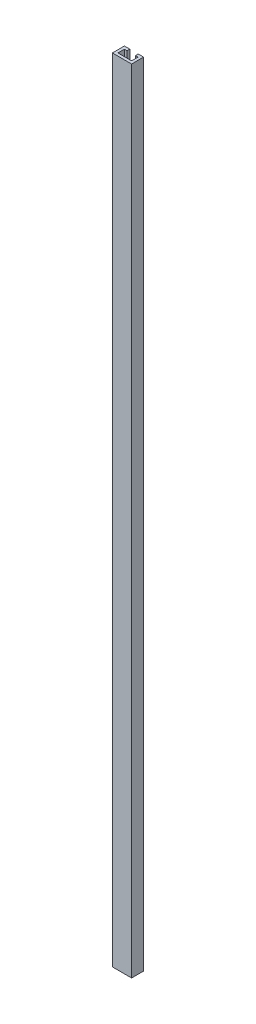
ISO-10303-21;
HEADER;
FILE_DESCRIPTION(('STEP AP214'),'2;1');
FILE_NAME('part.step','',(''),(''),'','','');
FILE_SCHEMA(('AUTOMOTIVE_DESIGN { 1 0 10303 214 1 1 1 1 }'));
ENDSEC;
DATA;
#1=APPLICATION_CONTEXT('core data for automotive mechanical design processes');
#2=APPLICATION_PROTOCOL_DEFINITION('international standard','automotive_design',2000,#1);
#3=PRODUCT_CONTEXT('',#1,'mechanical');
#4=PRODUCT('Part','Part','',(#3));
#5=PRODUCT_RELATED_PRODUCT_CATEGORY('part','',(#4));
#6=PRODUCT_DEFINITION_FORMATION('','',#4);
#7=PRODUCT_DEFINITION_CONTEXT('part definition',#1,'design');
#8=PRODUCT_DEFINITION('design','',#6,#7);
#9=PRODUCT_DEFINITION_SHAPE('','',#8);
#10=(LENGTH_UNIT() NAMED_UNIT(*) SI_UNIT(.MILLI.,.METRE.));
#11=(NAMED_UNIT(*) PLANE_ANGLE_UNIT() SI_UNIT($,.RADIAN.));
#12=(NAMED_UNIT(*) SI_UNIT($,.STERADIAN.) SOLID_ANGLE_UNIT());
#13=UNCERTAINTY_MEASURE_WITH_UNIT(LENGTH_MEASURE(1.E-05),#10,'distance_accuracy_value','');
#14=(GEOMETRIC_REPRESENTATION_CONTEXT(3) GLOBAL_UNCERTAINTY_ASSIGNED_CONTEXT((#13)) GLOBAL_UNIT_ASSIGNED_CONTEXT((#10,
#11,#12)) REPRESENTATION_CONTEXT('',''));
#15=CARTESIAN_POINT('',(0.,0.,0.));
#16=DIRECTION('',(0.,0.,1.));
#17=DIRECTION('',(1.,0.,0.));
#18=AXIS2_PLACEMENT_3D('',#15,#16,#17);
#19=CARTESIAN_POINT('',(0.,330.,0.));
#20=DIRECTION('',(1.,0.,0.));
#21=DIRECTION('',(0.,0.,-1.));
#22=AXIS2_PLACEMENT_3D('',#19,#20,#21);
#23=PLANE('',#22);
#24=DIRECTION('',(0.,0.,1.));
#25=VECTOR('',#24,1.);
#26=CARTESIAN_POINT('',(0.,0.,0.));
#27=LINE('',#26,#25);
#28=CARTESIAN_POINT('',(0.,0.,0.));
#29=VERTEX_POINT('',#28);
#30=CARTESIAN_POINT('',(0.,0.,5.));
#31=VERTEX_POINT('',#30);
#32=EDGE_CURVE('E156',#29,#31,#27,.T.);
#33=ORIENTED_EDGE('',*,*,#32,.T.);
#34=DIRECTION('',(0.,-1.,0.));
#35=VECTOR('',#34,1.);
#36=CARTESIAN_POINT('',(0.,330.,5.));
#37=LINE('',#36,#35);
#38=CARTESIAN_POINT('',(0.,330.,5.));
#39=VERTEX_POINT('',#38);
#40=EDGE_CURVE('E11',#39,#31,#37,.T.);
#41=ORIENTED_EDGE('',*,*,#40,.F.);
#42=DIRECTION('',(0.,0.,1.));
#43=VECTOR('',#42,1.);
#44=CARTESIAN_POINT('',(0.,330.,0.));
#45=LINE('',#44,#43);
#46=CARTESIAN_POINT('',(0.,330.,0.));
#47=VERTEX_POINT('',#46);
#48=EDGE_CURVE('E178',#47,#39,#45,.T.);
#49=ORIENTED_EDGE('',*,*,#48,.F.);
#50=DIRECTION('',(0.,-1.,0.));
#51=VECTOR('',#50,1.);
#52=CARTESIAN_POINT('',(0.,330.,0.));
#53=LINE('',#52,#51);
#54=EDGE_CURVE('E152',#47,#29,#53,.T.);
#55=ORIENTED_EDGE('',*,*,#54,.T.);
#56=EDGE_LOOP('',(#33,#41,#49,#55));
#57=FACE_BOUND('',#56,.T.);
#58=ADVANCED_FACE('F36',(#57),#23,.F.);
#59=CARTESIAN_POINT('',(0.,330.,5.));
#60=DIRECTION('',(0.,0.,-1.));
#61=DIRECTION('',(-1.,0.,0.));
#62=AXIS2_PLACEMENT_3D('',#59,#60,#61);
#63=PLANE('',#62);
#64=DIRECTION('',(1.,0.,0.));
#65=VECTOR('',#64,1.);
#66=CARTESIAN_POINT('',(0.,0.,5.));
#67=LINE('',#66,#65);
#68=CARTESIAN_POINT('',(8.,0.,5.));
#69=VERTEX_POINT('',#68);
#70=EDGE_CURVE('E159',#31,#69,#67,.T.);
#71=ORIENTED_EDGE('',*,*,#70,.T.);
#72=DIRECTION('',(0.,-1.,0.));
#73=VECTOR('',#72,1.);
#74=CARTESIAN_POINT('',(8.,330.,5.));
#75=LINE('',#74,#73);
#76=CARTESIAN_POINT('',(8.,330.,5.));
#77=VERTEX_POINT('',#76);
#78=EDGE_CURVE('E44',#77,#69,#75,.T.);
#79=ORIENTED_EDGE('',*,*,#78,.F.);
#80=DIRECTION('',(1.,0.,0.));
#81=VECTOR('',#80,1.);
#82=CARTESIAN_POINT('',(0.,330.,5.));
#83=LINE('',#82,#81);
#84=EDGE_CURVE('E107',#39,#77,#83,.T.);
#85=ORIENTED_EDGE('',*,*,#84,.F.);
#86=ORIENTED_EDGE('',*,*,#40,.T.);
#87=EDGE_LOOP('',(#71,#79,#85,#86));
#88=FACE_BOUND('',#87,.T.);
#89=ADVANCED_FACE('F256',(#88),#63,.F.);
#90=CARTESIAN_POINT('',(8.,330.,5.));
#91=DIRECTION('',(-1.,0.,0.));
#92=DIRECTION('',(0.,0.,1.));
#93=AXIS2_PLACEMENT_3D('',#90,#91,#92);
#94=PLANE('',#93);
#95=DIRECTION('',(0.,0.,-1.));
#96=VECTOR('',#95,1.);
#97=CARTESIAN_POINT('',(8.,0.,5.));
#98=LINE('',#97,#96);
#99=CARTESIAN_POINT('',(8.,0.,0.));
#100=VERTEX_POINT('',#99);
#101=EDGE_CURVE('E161',#69,#100,#98,.T.);
#102=ORIENTED_EDGE('',*,*,#101,.T.);
#103=DIRECTION('',(0.,-1.,0.));
#104=VECTOR('',#103,1.);
#105=CARTESIAN_POINT('',(8.,330.,0.));
#106=LINE('',#105,#104);
#107=CARTESIAN_POINT('',(8.,330.,0.));
#108=VERTEX_POINT('',#107);
#109=EDGE_CURVE('E197',#108,#100,#106,.T.);
#110=ORIENTED_EDGE('',*,*,#109,.F.);
#111=DIRECTION('',(0.,0.,-1.));
#112=VECTOR('',#111,1.);
#113=CARTESIAN_POINT('',(8.,330.,5.));
#114=LINE('',#113,#112);
#115=EDGE_CURVE('E205',#77,#108,#114,.T.);
#116=ORIENTED_EDGE('',*,*,#115,.F.);
#117=ORIENTED_EDGE('',*,*,#78,.T.);
#118=EDGE_LOOP('',(#102,#110,#116,#117));
#119=FACE_BOUND('',#118,.T.);
#120=ADVANCED_FACE('F203',(#119),#94,.F.);
#121=CARTESIAN_POINT('',(8.,330.,0.));
#122=DIRECTION('',(0.,0.,1.));
#123=DIRECTION('',(1.,0.,0.));
#124=AXIS2_PLACEMENT_3D('',#121,#122,#123);
#125=PLANE('',#124);
#126=DIRECTION('',(-1.,0.,0.));
#127=VECTOR('',#126,1.);
#128=CARTESIAN_POINT('',(8.,0.,0.));
#129=LINE('',#128,#127);
#130=CARTESIAN_POINT('',(5.75,0.,0.));
#131=VERTEX_POINT('',#130);
#132=EDGE_CURVE('E163',#100,#131,#129,.T.);
#133=ORIENTED_EDGE('',*,*,#132,.T.);
#134=DIRECTION('',(0.,-1.,0.));
#135=VECTOR('',#134,1.);
#136=CARTESIAN_POINT('',(5.75,330.,0.));
#137=LINE('',#136,#135);
#138=CARTESIAN_POINT('',(5.75,330.,0.));
#139=VERTEX_POINT('',#138);
#140=EDGE_CURVE('E194',#139,#131,#137,.T.);
#141=ORIENTED_EDGE('',*,*,#140,.F.);
#142=DIRECTION('',(-1.,0.,0.));
#143=VECTOR('',#142,1.);
#144=CARTESIAN_POINT('',(8.,330.,0.));
#145=LINE('',#144,#143);
#146=EDGE_CURVE('E223',#108,#139,#145,.T.);
#147=ORIENTED_EDGE('',*,*,#146,.F.);
#148=ORIENTED_EDGE('',*,*,#109,.T.);
#149=EDGE_LOOP('',(#133,#141,#147,#148));
#150=FACE_BOUND('',#149,.T.);
#151=ADVANCED_FACE('F214',(#150),#125,.F.);
#152=CARTESIAN_POINT('',(5.75,330.,0.));
#153=DIRECTION('',(1.,0.,0.));
#154=DIRECTION('',(0.,0.,-1.));
#155=AXIS2_PLACEMENT_3D('',#152,#153,#154);
#156=PLANE('',#155);
#157=DIRECTION('',(0.,0.,1.));
#158=VECTOR('',#157,1.);
#159=CARTESIAN_POINT('',(5.75,0.,0.));
#160=LINE('',#159,#158);
#161=CARTESIAN_POINT('',(5.75,0.,1.15));
#162=VERTEX_POINT('',#161);
#163=EDGE_CURVE('E165',#131,#162,#160,.T.);
#164=ORIENTED_EDGE('',*,*,#163,.T.);
#165=DIRECTION('',(0.,-1.,0.));
#166=VECTOR('',#165,1.);
#167=CARTESIAN_POINT('',(5.75,330.,1.15));
#168=LINE('',#167,#166);
#169=CARTESIAN_POINT('',(5.75,330.,1.15));
#170=VERTEX_POINT('',#169);
#171=EDGE_CURVE('E191',#170,#162,#168,.T.);
#172=ORIENTED_EDGE('',*,*,#171,.F.);
#173=DIRECTION('',(0.,0.,1.));
#174=VECTOR('',#173,1.);
#175=CARTESIAN_POINT('',(5.75,330.,0.));
#176=LINE('',#175,#174);
#177=EDGE_CURVE('E220',#139,#170,#176,.T.);
#178=ORIENTED_EDGE('',*,*,#177,.F.);
#179=ORIENTED_EDGE('',*,*,#140,.T.);
#180=EDGE_LOOP('',(#164,#172,#178,#179));
#181=FACE_BOUND('',#180,.T.);
#182=ADVANCED_FACE('F218',(#181),#156,.F.);
#183=CARTESIAN_POINT('',(5.75,330.,1.15));
#184=DIRECTION('',(0.,0.,-1.));
#185=DIRECTION('',(-1.,0.,0.));
#186=AXIS2_PLACEMENT_3D('',#183,#184,#185);
#187=PLANE('',#186);
#188=DIRECTION('',(1.,0.,0.));
#189=VECTOR('',#188,1.);
#190=CARTESIAN_POINT('',(5.75,0.,1.15));
#191=LINE('',#190,#189);
#192=CARTESIAN_POINT('',(6.85,0.,1.15));
#193=VERTEX_POINT('',#192);
#194=EDGE_CURVE('E167',#162,#193,#191,.T.);
#195=ORIENTED_EDGE('',*,*,#194,.T.);
#196=DIRECTION('',(0.,-1.,0.));
#197=VECTOR('',#196,1.);
#198=CARTESIAN_POINT('',(6.85,330.,1.15));
#199=LINE('',#198,#197);
#200=CARTESIAN_POINT('',(6.85,330.,1.15));
#201=VERTEX_POINT('',#200);
#202=EDGE_CURVE('E188',#201,#193,#199,.T.);
#203=ORIENTED_EDGE('',*,*,#202,.F.);
#204=DIRECTION('',(1.,0.,0.));
#205=VECTOR('',#204,1.);
#206=CARTESIAN_POINT('',(5.75,330.,1.15));
#207=LINE('',#206,#205);
#208=EDGE_CURVE('E222',#170,#201,#207,.T.);
#209=ORIENTED_EDGE('',*,*,#208,.F.);
#210=ORIENTED_EDGE('',*,*,#171,.T.);
#211=EDGE_LOOP('',(#195,#203,#209,#210));
#212=FACE_BOUND('',#211,.T.);
#213=ADVANCED_FACE('F269',(#212),#187,.F.);
#214=CARTESIAN_POINT('',(6.85,330.,1.15));
#215=DIRECTION('',(1.,0.,0.));
#216=DIRECTION('',(0.,0.,-1.));
#217=AXIS2_PLACEMENT_3D('',#214,#215,#216);
#218=PLANE('',#217);
#219=DIRECTION('',(0.,0.,1.));
#220=VECTOR('',#219,1.);
#221=CARTESIAN_POINT('',(6.85,0.,1.15));
#222=LINE('',#221,#220);
#223=CARTESIAN_POINT('',(6.85,0.,3.85));
#224=VERTEX_POINT('',#223);
#225=EDGE_CURVE('E169',#193,#224,#222,.T.);
#226=ORIENTED_EDGE('',*,*,#225,.T.);
#227=DIRECTION('',(0.,-1.,0.));
#228=VECTOR('',#227,1.);
#229=CARTESIAN_POINT('',(6.85,330.,3.85));
#230=LINE('',#229,#228);
#231=CARTESIAN_POINT('',(6.85,330.,3.85));
#232=VERTEX_POINT('',#231);
#233=EDGE_CURVE('E185',#232,#224,#230,.T.);
#234=ORIENTED_EDGE('',*,*,#233,.F.);
#235=DIRECTION('',(0.,0.,1.));
#236=VECTOR('',#235,1.);
#237=CARTESIAN_POINT('',(6.85,330.,1.15));
#238=LINE('',#237,#236);
#239=EDGE_CURVE('E225',#201,#232,#238,.T.);
#240=ORIENTED_EDGE('',*,*,#239,.F.);
#241=ORIENTED_EDGE('',*,*,#202,.T.);
#242=EDGE_LOOP('',(#226,#234,#240,#241));
#243=FACE_BOUND('',#242,.T.);
#244=ADVANCED_FACE('F272',(#243),#218,.F.);
#245=CARTESIAN_POINT('',(6.85,330.,3.85));
#246=DIRECTION('',(0.,0.,1.));
#247=DIRECTION('',(1.,0.,0.));
#248=AXIS2_PLACEMENT_3D('',#245,#246,#247);
#249=PLANE('',#248);
#250=DIRECTION('',(-1.,0.,0.));
#251=VECTOR('',#250,1.);
#252=CARTESIAN_POINT('',(6.85,0.,3.85));
#253=LINE('',#252,#251);
#254=CARTESIAN_POINT('',(1.15,0.,3.85));
#255=VERTEX_POINT('',#254);
#256=EDGE_CURVE('E171',#224,#255,#253,.T.);
#257=ORIENTED_EDGE('',*,*,#256,.T.);
#258=DIRECTION('',(0.,-1.,0.));
#259=VECTOR('',#258,1.);
#260=CARTESIAN_POINT('',(1.15,330.,3.85));
#261=LINE('',#260,#259);
#262=CARTESIAN_POINT('',(1.15,330.,3.85));
#263=VERTEX_POINT('',#262);
#264=EDGE_CURVE('E182',#263,#255,#261,.T.);
#265=ORIENTED_EDGE('',*,*,#264,.F.);
#266=DIRECTION('',(-1.,0.,0.));
#267=VECTOR('',#266,1.);
#268=CARTESIAN_POINT('',(6.85,330.,3.85));
#269=LINE('',#268,#267);
#270=EDGE_CURVE('E231',#232,#263,#269,.T.);
#271=ORIENTED_EDGE('',*,*,#270,.F.);
#272=ORIENTED_EDGE('',*,*,#233,.T.);
#273=EDGE_LOOP('',(#257,#265,#271,#272));
#274=FACE_BOUND('',#273,.T.);
#275=ADVANCED_FACE('F237',(#274),#249,.F.);
#276=CARTESIAN_POINT('',(1.15,330.,3.85));
#277=DIRECTION('',(-1.,0.,0.));
#278=DIRECTION('',(0.,0.,1.));
#279=AXIS2_PLACEMENT_3D('',#276,#277,#278);
#280=PLANE('',#279);
#281=DIRECTION('',(0.,0.,-1.));
#282=VECTOR('',#281,1.);
#283=CARTESIAN_POINT('',(1.15,0.,3.85));
#284=LINE('',#283,#282);
#285=CARTESIAN_POINT('',(1.15,0.,1.15));
#286=VERTEX_POINT('',#285);
#287=EDGE_CURVE('E173',#255,#286,#284,.T.);
#288=ORIENTED_EDGE('',*,*,#287,.T.);
#289=DIRECTION('',(0.,-1.,0.));
#290=VECTOR('',#289,1.);
#291=CARTESIAN_POINT('',(1.15,330.,1.15));
#292=LINE('',#291,#290);
#293=CARTESIAN_POINT('',(1.15,330.,1.15));
#294=VERTEX_POINT('',#293);
#295=EDGE_CURVE('E147',#294,#286,#292,.T.);
#296=ORIENTED_EDGE('',*,*,#295,.F.);
#297=DIRECTION('',(0.,0.,-1.));
#298=VECTOR('',#297,1.);
#299=CARTESIAN_POINT('',(1.15,330.,3.85));
#300=LINE('',#299,#298);
#301=EDGE_CURVE('E138',#263,#294,#300,.T.);
#302=ORIENTED_EDGE('',*,*,#301,.F.);
#303=ORIENTED_EDGE('',*,*,#264,.T.);
#304=EDGE_LOOP('',(#288,#296,#302,#303));
#305=FACE_BOUND('',#304,.T.);
#306=ADVANCED_FACE('F241',(#305),#280,.F.);
#307=CARTESIAN_POINT('',(1.15,330.,1.15));
#308=DIRECTION('',(0.,0.,-1.));
#309=DIRECTION('',(-1.,0.,0.));
#310=AXIS2_PLACEMENT_3D('',#307,#308,#309);
#311=PLANE('',#310);
#312=DIRECTION('',(1.,0.,0.));
#313=VECTOR('',#312,1.);
#314=CARTESIAN_POINT('',(1.15,0.,1.15));
#315=LINE('',#314,#313);
#316=CARTESIAN_POINT('',(2.25,0.,1.15));
#317=VERTEX_POINT('',#316);
#318=EDGE_CURVE('E146',#286,#317,#315,.T.);
#319=ORIENTED_EDGE('',*,*,#318,.T.);
#320=DIRECTION('',(0.,-1.,0.));
#321=VECTOR('',#320,1.);
#322=CARTESIAN_POINT('',(2.25,330.,1.15));
#323=LINE('',#322,#321);
#324=CARTESIAN_POINT('',(2.25,330.,1.15));
#325=VERTEX_POINT('',#324);
#326=EDGE_CURVE('E143',#325,#317,#323,.T.);
#327=ORIENTED_EDGE('',*,*,#326,.F.);
#328=DIRECTION('',(1.,0.,0.));
#329=VECTOR('',#328,1.);
#330=CARTESIAN_POINT('',(1.15,330.,1.15));
#331=LINE('',#330,#329);
#332=EDGE_CURVE('E132',#294,#325,#331,.T.);
#333=ORIENTED_EDGE('',*,*,#332,.F.);
#334=ORIENTED_EDGE('',*,*,#295,.T.);
#335=EDGE_LOOP('',(#319,#327,#333,#334));
#336=FACE_BOUND('',#335,.T.);
#337=ADVANCED_FACE('F144',(#336),#311,.F.);
#338=CARTESIAN_POINT('',(2.25,330.,1.15));
#339=DIRECTION('',(-1.,0.,0.));
#340=DIRECTION('',(0.,0.,1.));
#341=AXIS2_PLACEMENT_3D('',#338,#339,#340);
#342=PLANE('',#341);
#343=DIRECTION('',(0.,0.,-1.));
#344=VECTOR('',#343,1.);
#345=CARTESIAN_POINT('',(2.25,0.,1.15));
#346=LINE('',#345,#344);
#347=CARTESIAN_POINT('',(2.25,0.,0.));
#348=VERTEX_POINT('',#347);
#349=EDGE_CURVE('E93',#317,#348,#346,.T.);
#350=ORIENTED_EDGE('',*,*,#349,.T.);
#351=DIRECTION('',(0.,-1.,0.));
#352=VECTOR('',#351,1.);
#353=CARTESIAN_POINT('',(2.25,330.,0.));
#354=LINE('',#353,#352);
#355=CARTESIAN_POINT('',(2.25,330.,0.));
#356=VERTEX_POINT('',#355);
#357=EDGE_CURVE('E148',#356,#348,#354,.T.);
#358=ORIENTED_EDGE('',*,*,#357,.F.);
#359=DIRECTION('',(0.,0.,-1.));
#360=VECTOR('',#359,1.);
#361=CARTESIAN_POINT('',(2.25,330.,1.15));
#362=LINE('',#361,#360);
#363=EDGE_CURVE('E136',#325,#356,#362,.T.);
#364=ORIENTED_EDGE('',*,*,#363,.F.);
#365=ORIENTED_EDGE('',*,*,#326,.T.);
#366=EDGE_LOOP('',(#350,#358,#364,#365));
#367=FACE_BOUND('',#366,.T.);
#368=ADVANCED_FACE('F150',(#367),#342,.F.);
#369=CARTESIAN_POINT('',(2.25,330.,0.));
#370=DIRECTION('',(0.,0.,1.));
#371=DIRECTION('',(1.,0.,0.));
#372=AXIS2_PLACEMENT_3D('',#369,#370,#371);
#373=PLANE('',#372);
#374=DIRECTION('',(-1.,0.,0.));
#375=VECTOR('',#374,1.);
#376=CARTESIAN_POINT('',(2.25,0.,0.));
#377=LINE('',#376,#375);
#378=EDGE_CURVE('E99',#348,#29,#377,.T.);
#379=ORIENTED_EDGE('',*,*,#378,.T.);
#380=ORIENTED_EDGE('',*,*,#54,.F.);
#381=DIRECTION('',(-1.,0.,0.));
#382=VECTOR('',#381,1.);
#383=CARTESIAN_POINT('',(2.25,330.,0.));
#384=LINE('',#383,#382);
#385=EDGE_CURVE('E52',#356,#47,#384,.T.);
#386=ORIENTED_EDGE('',*,*,#385,.F.);
#387=ORIENTED_EDGE('',*,*,#357,.T.);
#388=EDGE_LOOP('',(#379,#380,#386,#387));
#389=FACE_BOUND('',#388,.T.);
#390=ADVANCED_FACE('F245',(#389),#373,.F.);
#391=CARTESIAN_POINT('',(0.,330.,0.));
#392=DIRECTION('',(0.,1.,0.));
#393=DIRECTION('',(0.,0.,1.));
#394=AXIS2_PLACEMENT_3D('',#391,#392,#393);
#395=PLANE('',#394);
#396=ORIENTED_EDGE('',*,*,#48,.T.);
#397=ORIENTED_EDGE('',*,*,#84,.T.);
#398=ORIENTED_EDGE('',*,*,#115,.T.);
#399=ORIENTED_EDGE('',*,*,#146,.T.);
#400=ORIENTED_EDGE('',*,*,#177,.T.);
#401=ORIENTED_EDGE('',*,*,#208,.T.);
#402=ORIENTED_EDGE('',*,*,#239,.T.);
#403=ORIENTED_EDGE('',*,*,#270,.T.);
#404=ORIENTED_EDGE('',*,*,#301,.T.);
#405=ORIENTED_EDGE('',*,*,#332,.T.);
#406=ORIENTED_EDGE('',*,*,#363,.T.);
#407=ORIENTED_EDGE('',*,*,#385,.T.);
#408=EDGE_LOOP('',(#396,#397,#398,#399,#400,#401,#402,#403,#404,#405,#406,#407));
#409=FACE_BOUND('',#408,.T.);
#410=ADVANCED_FACE('F134',(#409),#395,.T.);
#411=CARTESIAN_POINT('',(0.,0.,0.));
#412=DIRECTION('',(0.,1.,0.));
#413=DIRECTION('',(0.,0.,1.));
#414=AXIS2_PLACEMENT_3D('',#411,#412,#413);
#415=PLANE('',#414);
#416=ORIENTED_EDGE('',*,*,#32,.F.);
#417=ORIENTED_EDGE('',*,*,#378,.F.);
#418=ORIENTED_EDGE('',*,*,#349,.F.);
#419=ORIENTED_EDGE('',*,*,#318,.F.);
#420=ORIENTED_EDGE('',*,*,#287,.F.);
#421=ORIENTED_EDGE('',*,*,#256,.F.);
#422=ORIENTED_EDGE('',*,*,#225,.F.);
#423=ORIENTED_EDGE('',*,*,#194,.F.);
#424=ORIENTED_EDGE('',*,*,#163,.F.);
#425=ORIENTED_EDGE('',*,*,#132,.F.);
#426=ORIENTED_EDGE('',*,*,#101,.F.);
#427=ORIENTED_EDGE('',*,*,#70,.F.);
#428=EDGE_LOOP('',(#416,#417,#418,#419,#420,#421,#422,#423,#424,#425,#426,#427));
#429=FACE_BOUND('',#428,.T.);
#430=ADVANCED_FACE('F209',(#429),#415,.F.);
#431=CLOSED_SHELL('',(#58,#89,#120,#151,#182,#213,#244,#275,#306,#337,#368,#390,#410,#430));
#432=MANIFOLD_SOLID_BREP('B2',#431);
#433=ADVANCED_BREP_SHAPE_REPRESENTATION('',(#18,#432),#14);
#434=SHAPE_DEFINITION_REPRESENTATION(#9,#433);
ENDSEC;
END-ISO-10303-21;
